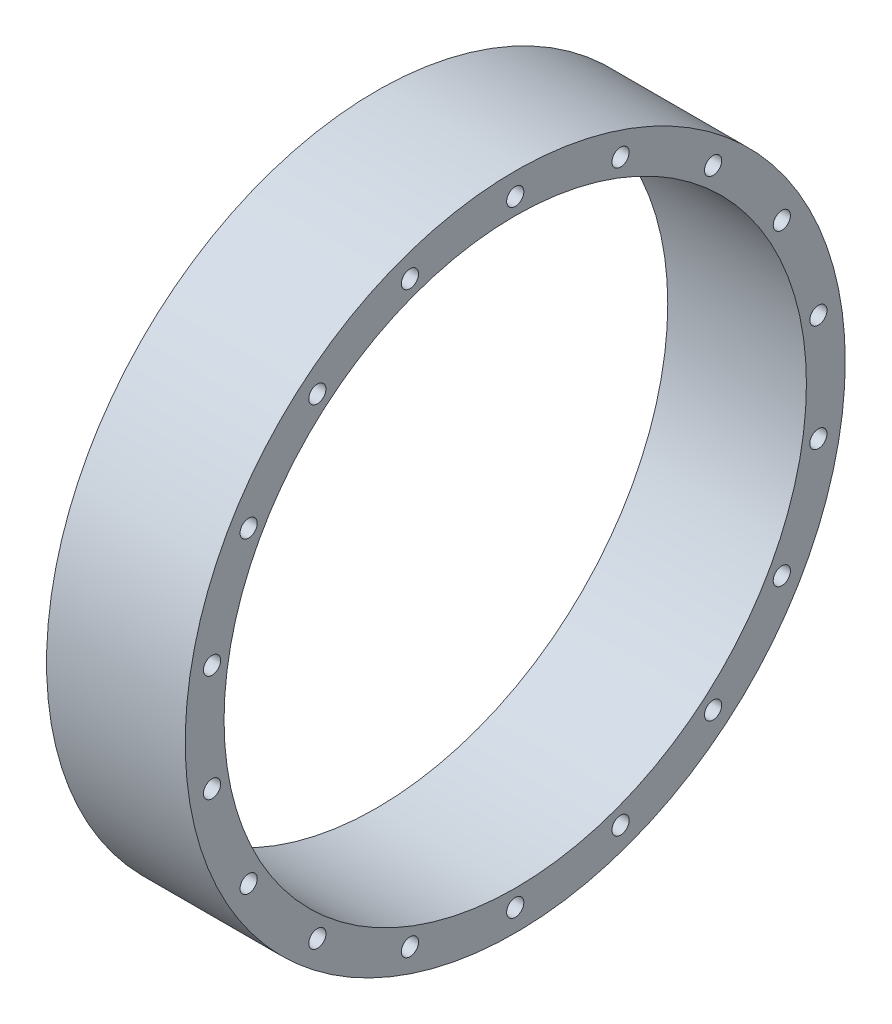
ISO-10303-21;
HEADER;
FILE_DESCRIPTION(('STEP AP214'),'2;1');
FILE_NAME('part.step','',(''),(''),'','','');
FILE_SCHEMA(('AUTOMOTIVE_DESIGN { 1 0 10303 214 1 1 1 1 }'));
ENDSEC;
DATA;
#1=APPLICATION_CONTEXT('core data for automotive mechanical design processes');
#2=APPLICATION_PROTOCOL_DEFINITION('international standard','automotive_design',2000,#1);
#3=PRODUCT_CONTEXT('',#1,'mechanical');
#4=PRODUCT('Part','Part','',(#3));
#5=PRODUCT_RELATED_PRODUCT_CATEGORY('part','',(#4));
#6=PRODUCT_DEFINITION_FORMATION('','',#4);
#7=PRODUCT_DEFINITION_CONTEXT('part definition',#1,'design');
#8=PRODUCT_DEFINITION('design','',#6,#7);
#9=PRODUCT_DEFINITION_SHAPE('','',#8);
#10=(LENGTH_UNIT() NAMED_UNIT(*) SI_UNIT(.MILLI.,.METRE.));
#11=(NAMED_UNIT(*) PLANE_ANGLE_UNIT() SI_UNIT($,.RADIAN.));
#12=(NAMED_UNIT(*) SI_UNIT($,.STERADIAN.) SOLID_ANGLE_UNIT());
#13=UNCERTAINTY_MEASURE_WITH_UNIT(LENGTH_MEASURE(1.E-05),#10,'distance_accuracy_value','');
#14=(GEOMETRIC_REPRESENTATION_CONTEXT(3) GLOBAL_UNCERTAINTY_ASSIGNED_CONTEXT((#13)) GLOBAL_UNIT_ASSIGNED_CONTEXT((#10,
#11,#12)) REPRESENTATION_CONTEXT('',''));
#15=CARTESIAN_POINT('',(0.,0.,0.));
#16=DIRECTION('',(0.,0.,1.));
#17=DIRECTION('',(1.,0.,0.));
#18=AXIS2_PLACEMENT_3D('',#15,#16,#17);
#19=CARTESIAN_POINT('',(25.,0.,0.));
#20=DIRECTION('',(1.,0.,0.));
#21=DIRECTION('',(0.,0.,-1.));
#22=AXIS2_PLACEMENT_3D('',#19,#20,#21);
#23=PLANE('',#22);
#24=CARTESIAN_POINT('',(25.,52.1529404536182,-18.982117954574));
#25=DIRECTION('',(1.,0.,0.));
#26=DIRECTION('',(0.,-0.342020143325657,-0.939692620785913));
#27=AXIS2_PLACEMENT_3D('',#24,#25,#26);
#28=CIRCLE('',#27,1.55);
#29=CARTESIAN_POINT('',(25.,51.6228092314634,-20.4386415167921));
#30=VERTEX_POINT('',#29);
#31=EDGE_CURVE('E72',#30,#30,#28,.T.);
#32=ORIENTED_EDGE('',*,*,#31,.F.);
#33=EDGE_LOOP('',(#32));
#34=FACE_BOUND('',#33,.T.);
#35=CARTESIAN_POINT('',(25.,42.5154665931037,-35.6747123376024));
#36=DIRECTION('',(1.,0.,0.));
#37=DIRECTION('',(0.,-0.64278760968653,-0.766044443118986));
#38=AXIS2_PLACEMENT_3D('',#35,#36,#37);
#39=CIRCLE('',#38,1.55);
#40=CARTESIAN_POINT('',(25.,41.5191457980896,-36.8620812244368));
#41=VERTEX_POINT('',#40);
#42=EDGE_CURVE('E78',#41,#41,#39,.T.);
#43=ORIENTED_EDGE('',*,*,#42,.F.);
#44=EDGE_LOOP('',(#43));
#45=FACE_BOUND('',#44,.T.);
#46=CARTESIAN_POINT('',(25.,27.7500000000006,-48.064409910036));
#47=DIRECTION('',(1.,0.,0.));
#48=DIRECTION('',(0.,-0.866025403784433,-0.50000000000001));
#49=AXIS2_PLACEMENT_3D('',#46,#47,#48);
#50=CIRCLE('',#49,1.55);
#51=CARTESIAN_POINT('',(25.,26.4076606241347,-48.839409910036));
#52=VERTEX_POINT('',#51);
#53=EDGE_CURVE('E84',#52,#52,#50,.T.);
#54=ORIENTED_EDGE('',*,*,#53,.F.);
#55=EDGE_LOOP('',(#54));
#56=FACE_BOUND('',#55,.T.);
#57=CARTESIAN_POINT('',(25.,9.6374738605152,-54.6568302921774));
#58=DIRECTION('',(1.,0.,0.));
#59=DIRECTION('',(0.,-0.984807753012206,-0.17364817766694));
#60=AXIS2_PLACEMENT_3D('',#57,#58,#59);
#61=CIRCLE('',#60,1.55);
#62=CARTESIAN_POINT('',(25.,8.11102184334628,-54.9259849675612));
#63=VERTEX_POINT('',#62);
#64=EDGE_CURVE('E90',#63,#63,#61,.T.);
#65=ORIENTED_EDGE('',*,*,#64,.F.);
#66=EDGE_LOOP('',(#65));
#67=FACE_BOUND('',#66,.T.);
#68=CARTESIAN_POINT('',(25.,-9.6374738605141,-54.6568302921776));
#69=DIRECTION('',(1.,0.,0.));
#70=DIRECTION('',(0.,-0.98480775301221,0.173648177666921));
#71=AXIS2_PLACEMENT_3D('',#68,#69,#70);
#72=CIRCLE('',#71,1.55);
#73=CARTESIAN_POINT('',(25.,-11.163925877683,-54.3876756167939));
#74=VERTEX_POINT('',#73);
#75=EDGE_CURVE('E96',#74,#74,#72,.T.);
#76=ORIENTED_EDGE('',*,*,#75,.F.);
#77=EDGE_LOOP('',(#76));
#78=FACE_BOUND('',#77,.T.);
#79=CARTESIAN_POINT('',(25.,-27.7499999999996,-48.0644099100366));
#80=DIRECTION('',(1.,0.,0.));
#81=DIRECTION('',(0.,-0.866025403784443,0.499999999999992));
#82=AXIS2_PLACEMENT_3D('',#79,#80,#81);
#83=CIRCLE('',#82,1.55);
#84=CARTESIAN_POINT('',(25.,-29.0923393758654,-47.2894099100366));
#85=VERTEX_POINT('',#84);
#86=EDGE_CURVE('E102',#85,#85,#83,.T.);
#87=ORIENTED_EDGE('',*,*,#86,.F.);
#88=EDGE_LOOP('',(#87));
#89=FACE_BOUND('',#88,.T.);
#90=CARTESIAN_POINT('',(25.,-42.515466593103,-35.6747123376033));
#91=DIRECTION('',(1.,0.,0.));
#92=DIRECTION('',(0.,-0.642787609686546,0.766044443118973));
#93=AXIS2_PLACEMENT_3D('',#90,#91,#92);
#94=CIRCLE('',#93,1.55);
#95=CARTESIAN_POINT('',(25.,-43.5117873881171,-34.4873434507689));
#96=VERTEX_POINT('',#95);
#97=EDGE_CURVE('E108',#96,#96,#94,.T.);
#98=ORIENTED_EDGE('',*,*,#97,.F.);
#99=EDGE_LOOP('',(#98));
#100=FACE_BOUND('',#99,.T.);
#101=CARTESIAN_POINT('',(25.,-52.1529404536178,-18.982117954575));
#102=DIRECTION('',(1.,0.,0.));
#103=DIRECTION('',(0.,-0.342020143325676,0.939692620785906));
#104=AXIS2_PLACEMENT_3D('',#101,#102,#103);
#105=CIRCLE('',#104,1.55);
#106=CARTESIAN_POINT('',(25.,-52.6830716757726,-17.5255943923569));
#107=VERTEX_POINT('',#106);
#108=EDGE_CURVE('E114',#107,#107,#105,.T.);
#109=ORIENTED_EDGE('',*,*,#108,.F.);
#110=EDGE_LOOP('',(#109));
#111=FACE_BOUND('',#110,.T.);
#112=CARTESIAN_POINT('',(25.,-55.5,0.));
#113=DIRECTION('',(1.,0.,0.));
#114=DIRECTION('',(0.,0.,1.));
#115=AXIS2_PLACEMENT_3D('',#112,#113,#114);
#116=CIRCLE('',#115,1.55);
#117=CARTESIAN_POINT('',(25.,-55.5,1.55));
#118=VERTEX_POINT('',#117);
#119=EDGE_CURVE('E120',#118,#118,#116,.T.);
#120=ORIENTED_EDGE('',*,*,#119,.F.);
#121=EDGE_LOOP('',(#120));
#122=FACE_BOUND('',#121,.T.);
#123=CARTESIAN_POINT('',(25.,-52.152940453618,18.9821179545743));
#124=DIRECTION('',(1.,0.,0.));
#125=DIRECTION('',(0.,0.342020143325663,0.939692620785911));
#126=AXIS2_PLACEMENT_3D('',#123,#124,#125);
#127=CIRCLE('',#126,1.55);
#128=CARTESIAN_POINT('',(25.,-51.6228092314633,20.4386415167925));
#129=VERTEX_POINT('',#128);
#130=EDGE_CURVE('E126',#129,#129,#127,.T.);
#131=ORIENTED_EDGE('',*,*,#130,.F.);
#132=EDGE_LOOP('',(#131));
#133=FACE_BOUND('',#132,.T.);
#134=CARTESIAN_POINT('',(25.,-42.5154665931035,35.6747123376027));
#135=DIRECTION('',(1.,0.,0.));
#136=DIRECTION('',(0.,0.642787609686535,0.766044443118981));
#137=AXIS2_PLACEMENT_3D('',#134,#135,#136);
#138=CIRCLE('',#137,1.55);
#139=CARTESIAN_POINT('',(25.,-41.5191457980893,36.8620812244371));
#140=VERTEX_POINT('',#139);
#141=EDGE_CURVE('E132',#140,#140,#138,.T.);
#142=ORIENTED_EDGE('',*,*,#141,.F.);
#143=EDGE_LOOP('',(#142));
#144=FACE_BOUND('',#143,.T.);
#145=CARTESIAN_POINT('',(25.,-27.7500000000002,48.0644099100362));
#146=DIRECTION('',(1.,0.,0.));
#147=DIRECTION('',(0.,0.866025403784436,0.500000000000004));
#148=AXIS2_PLACEMENT_3D('',#145,#146,#147);
#149=CIRCLE('',#148,1.55);
#150=CARTESIAN_POINT('',(25.,-26.4076606241344,48.8394099100362));
#151=VERTEX_POINT('',#150);
#152=EDGE_CURVE('E138',#151,#151,#149,.T.);
#153=ORIENTED_EDGE('',*,*,#152,.F.);
#154=EDGE_LOOP('',(#153));
#155=FACE_BOUND('',#154,.T.);
#156=CARTESIAN_POINT('',(25.,-9.63747386051484,54.6568302921775));
#157=DIRECTION('',(1.,0.,0.));
#158=DIRECTION('',(0.,0.984807753012207,0.173648177666934));
#159=AXIS2_PLACEMENT_3D('',#156,#157,#158);
#160=CIRCLE('',#159,1.55);
#161=CARTESIAN_POINT('',(25.,-8.11102184334592,54.9259849675613));
#162=VERTEX_POINT('',#161);
#163=EDGE_CURVE('E144',#162,#162,#160,.T.);
#164=ORIENTED_EDGE('',*,*,#163,.F.);
#165=EDGE_LOOP('',(#164));
#166=FACE_BOUND('',#165,.T.);
#167=CARTESIAN_POINT('',(25.,9.63747386051447,54.6568302921776));
#168=DIRECTION('',(1.,0.,0.));
#169=DIRECTION('',(0.,0.984807753012209,-0.173648177666927));
#170=AXIS2_PLACEMENT_3D('',#167,#168,#169);
#171=CIRCLE('',#170,1.55);
#172=CARTESIAN_POINT('',(25.,11.1639258776834,54.3876756167938));
#173=VERTEX_POINT('',#172);
#174=EDGE_CURVE('E150',#173,#173,#171,.T.);
#175=ORIENTED_EDGE('',*,*,#174,.F.);
#176=EDGE_LOOP('',(#175));
#177=FACE_BOUND('',#176,.T.);
#178=CARTESIAN_POINT('',(25.,27.7499999999999,48.0644099100364));
#179=DIRECTION('',(1.,0.,0.));
#180=DIRECTION('',(0.,0.86602540378444,-0.499999999999998));
#181=AXIS2_PLACEMENT_3D('',#178,#179,#180);
#182=CIRCLE('',#181,1.55);
#183=CARTESIAN_POINT('',(25.,29.0923393758658,47.2894099100364));
#184=VERTEX_POINT('',#183);
#185=EDGE_CURVE('E156',#184,#184,#182,.T.);
#186=ORIENTED_EDGE('',*,*,#185,.F.);
#187=EDGE_LOOP('',(#186));
#188=FACE_BOUND('',#187,.T.);
#189=CARTESIAN_POINT('',(25.,42.5154665931032,35.674712337603));
#190=DIRECTION('',(1.,0.,0.));
#191=DIRECTION('',(0.,0.642787609686541,-0.766044443118977));
#192=AXIS2_PLACEMENT_3D('',#189,#190,#191);
#193=CIRCLE('',#192,1.55);
#194=CARTESIAN_POINT('',(25.,43.5117873881174,34.4873434507686));
#195=VERTEX_POINT('',#194);
#196=EDGE_CURVE('E162',#195,#195,#193,.T.);
#197=ORIENTED_EDGE('',*,*,#196,.F.);
#198=EDGE_LOOP('',(#197));
#199=FACE_BOUND('',#198,.T.);
#200=CARTESIAN_POINT('',(25.,52.1529404536179,18.9821179545747));
#201=DIRECTION('',(1.,0.,0.));
#202=DIRECTION('',(0.,0.342020143325669,-0.939692620785908));
#203=AXIS2_PLACEMENT_3D('',#200,#201,#202);
#204=CIRCLE('',#203,1.55);
#205=CARTESIAN_POINT('',(25.,52.6830716757727,17.5255943923565));
#206=VERTEX_POINT('',#205);
#207=EDGE_CURVE('E66',#206,#206,#204,.T.);
#208=ORIENTED_EDGE('',*,*,#207,.F.);
#209=EDGE_LOOP('',(#208));
#210=FACE_BOUND('',#209,.T.);
#211=CARTESIAN_POINT('',(25.,55.5,0.));
#212=DIRECTION('',(1.,0.,0.));
#213=DIRECTION('',(0.,0.,-1.));
#214=AXIS2_PLACEMENT_3D('',#211,#212,#213);
#215=CIRCLE('',#214,1.55);
#216=CARTESIAN_POINT('',(25.,55.5,-1.55));
#217=VERTEX_POINT('',#216);
#218=EDGE_CURVE('E60',#217,#217,#215,.T.);
#219=ORIENTED_EDGE('',*,*,#218,.F.);
#220=EDGE_LOOP('',(#219));
#221=FACE_BOUND('',#220,.T.);
#222=CARTESIAN_POINT('',(25.,0.,0.));
#223=DIRECTION('',(1.,0.,0.));
#224=DIRECTION('',(0.,0.,-1.));
#225=AXIS2_PLACEMENT_3D('',#222,#223,#224);
#226=CIRCLE('',#225,59.5);
#227=CARTESIAN_POINT('',(25.,0.,-59.5));
#228=VERTEX_POINT('',#227);
#229=EDGE_CURVE('E10',#228,#228,#226,.T.);
#230=ORIENTED_EDGE('',*,*,#229,.T.);
#231=EDGE_LOOP('',(#230));
#232=FACE_BOUND('',#231,.T.);
#233=CARTESIAN_POINT('',(25.,0.,0.));
#234=DIRECTION('',(1.,0.,0.));
#235=DIRECTION('',(0.,0.,-1.));
#236=AXIS2_PLACEMENT_3D('',#233,#234,#235);
#237=CIRCLE('',#236,52.5);
#238=CARTESIAN_POINT('',(25.,0.,-52.5));
#239=VERTEX_POINT('',#238);
#240=EDGE_CURVE('E52',#239,#239,#237,.T.);
#241=ORIENTED_EDGE('',*,*,#240,.F.);
#242=EDGE_LOOP('',(#241));
#243=FACE_BOUND('',#242,.T.);
#244=ADVANCED_FACE('F41',(#34,#45,#56,#67,#78,#89,#100,#111,#122,#133,#144,#155,#166,#177,#188,
#199,#210,#221,#232,#243),#23,.T.);
#245=CARTESIAN_POINT('',(0.,0.,0.));
#246=DIRECTION('',(1.,0.,0.));
#247=DIRECTION('',(0.,0.,-1.));
#248=AXIS2_PLACEMENT_3D('',#245,#246,#247);
#249=PLANE('',#248);
#250=CARTESIAN_POINT('',(0.,52.1529404536182,-18.982117954574));
#251=DIRECTION('',(1.,0.,0.));
#252=DIRECTION('',(0.,-0.342020143325657,-0.939692620785913));
#253=AXIS2_PLACEMENT_3D('',#250,#251,#252);
#254=CIRCLE('',#253,1.55);
#255=CARTESIAN_POINT('',(0.,51.6228092314634,-20.4386415167921));
#256=VERTEX_POINT('',#255);
#257=EDGE_CURVE('E75',#256,#256,#254,.T.);
#258=ORIENTED_EDGE('',*,*,#257,.T.);
#259=EDGE_LOOP('',(#258));
#260=FACE_BOUND('',#259,.T.);
#261=CARTESIAN_POINT('',(0.,42.5154665931037,-35.6747123376024));
#262=DIRECTION('',(1.,0.,0.));
#263=DIRECTION('',(0.,-0.64278760968653,-0.766044443118986));
#264=AXIS2_PLACEMENT_3D('',#261,#262,#263);
#265=CIRCLE('',#264,1.55);
#266=CARTESIAN_POINT('',(0.,41.5191457980896,-36.8620812244368));
#267=VERTEX_POINT('',#266);
#268=EDGE_CURVE('E81',#267,#267,#265,.T.);
#269=ORIENTED_EDGE('',*,*,#268,.T.);
#270=EDGE_LOOP('',(#269));
#271=FACE_BOUND('',#270,.T.);
#272=CARTESIAN_POINT('',(0.,27.7500000000006,-48.064409910036));
#273=DIRECTION('',(1.,0.,0.));
#274=DIRECTION('',(0.,-0.866025403784433,-0.50000000000001));
#275=AXIS2_PLACEMENT_3D('',#272,#273,#274);
#276=CIRCLE('',#275,1.55);
#277=CARTESIAN_POINT('',(0.,26.4076606241347,-48.839409910036));
#278=VERTEX_POINT('',#277);
#279=EDGE_CURVE('E87',#278,#278,#276,.T.);
#280=ORIENTED_EDGE('',*,*,#279,.T.);
#281=EDGE_LOOP('',(#280));
#282=FACE_BOUND('',#281,.T.);
#283=CARTESIAN_POINT('',(0.,9.6374738605152,-54.6568302921774));
#284=DIRECTION('',(1.,0.,0.));
#285=DIRECTION('',(0.,-0.984807753012206,-0.17364817766694));
#286=AXIS2_PLACEMENT_3D('',#283,#284,#285);
#287=CIRCLE('',#286,1.55);
#288=CARTESIAN_POINT('',(0.,8.11102184334628,-54.9259849675612));
#289=VERTEX_POINT('',#288);
#290=EDGE_CURVE('E93',#289,#289,#287,.T.);
#291=ORIENTED_EDGE('',*,*,#290,.T.);
#292=EDGE_LOOP('',(#291));
#293=FACE_BOUND('',#292,.T.);
#294=CARTESIAN_POINT('',(0.,-9.6374738605141,-54.6568302921776));
#295=DIRECTION('',(1.,0.,0.));
#296=DIRECTION('',(0.,-0.98480775301221,0.173648177666921));
#297=AXIS2_PLACEMENT_3D('',#294,#295,#296);
#298=CIRCLE('',#297,1.55);
#299=CARTESIAN_POINT('',(0.,-11.163925877683,-54.3876756167939));
#300=VERTEX_POINT('',#299);
#301=EDGE_CURVE('E99',#300,#300,#298,.T.);
#302=ORIENTED_EDGE('',*,*,#301,.T.);
#303=EDGE_LOOP('',(#302));
#304=FACE_BOUND('',#303,.T.);
#305=CARTESIAN_POINT('',(0.,-27.7499999999996,-48.0644099100366));
#306=DIRECTION('',(1.,0.,0.));
#307=DIRECTION('',(0.,-0.866025403784443,0.499999999999992));
#308=AXIS2_PLACEMENT_3D('',#305,#306,#307);
#309=CIRCLE('',#308,1.55);
#310=CARTESIAN_POINT('',(0.,-29.0923393758654,-47.2894099100366));
#311=VERTEX_POINT('',#310);
#312=EDGE_CURVE('E105',#311,#311,#309,.T.);
#313=ORIENTED_EDGE('',*,*,#312,.T.);
#314=EDGE_LOOP('',(#313));
#315=FACE_BOUND('',#314,.T.);
#316=CARTESIAN_POINT('',(0.,-42.515466593103,-35.6747123376033));
#317=DIRECTION('',(1.,0.,0.));
#318=DIRECTION('',(0.,-0.642787609686546,0.766044443118973));
#319=AXIS2_PLACEMENT_3D('',#316,#317,#318);
#320=CIRCLE('',#319,1.55);
#321=CARTESIAN_POINT('',(0.,-43.5117873881171,-34.4873434507689));
#322=VERTEX_POINT('',#321);
#323=EDGE_CURVE('E111',#322,#322,#320,.T.);
#324=ORIENTED_EDGE('',*,*,#323,.T.);
#325=EDGE_LOOP('',(#324));
#326=FACE_BOUND('',#325,.T.);
#327=CARTESIAN_POINT('',(0.,-52.1529404536178,-18.982117954575));
#328=DIRECTION('',(1.,0.,0.));
#329=DIRECTION('',(0.,-0.342020143325676,0.939692620785906));
#330=AXIS2_PLACEMENT_3D('',#327,#328,#329);
#331=CIRCLE('',#330,1.55);
#332=CARTESIAN_POINT('',(0.,-52.6830716757726,-17.5255943923569));
#333=VERTEX_POINT('',#332);
#334=EDGE_CURVE('E117',#333,#333,#331,.T.);
#335=ORIENTED_EDGE('',*,*,#334,.T.);
#336=EDGE_LOOP('',(#335));
#337=FACE_BOUND('',#336,.T.);
#338=CARTESIAN_POINT('',(0.,-55.5,0.));
#339=DIRECTION('',(1.,0.,0.));
#340=DIRECTION('',(0.,0.,1.));
#341=AXIS2_PLACEMENT_3D('',#338,#339,#340);
#342=CIRCLE('',#341,1.55);
#343=CARTESIAN_POINT('',(0.,-55.5,1.55));
#344=VERTEX_POINT('',#343);
#345=EDGE_CURVE('E123',#344,#344,#342,.T.);
#346=ORIENTED_EDGE('',*,*,#345,.T.);
#347=EDGE_LOOP('',(#346));
#348=FACE_BOUND('',#347,.T.);
#349=CARTESIAN_POINT('',(0.,-52.152940453618,18.9821179545743));
#350=DIRECTION('',(1.,0.,0.));
#351=DIRECTION('',(0.,0.342020143325663,0.939692620785911));
#352=AXIS2_PLACEMENT_3D('',#349,#350,#351);
#353=CIRCLE('',#352,1.55);
#354=CARTESIAN_POINT('',(0.,-51.6228092314633,20.4386415167925));
#355=VERTEX_POINT('',#354);
#356=EDGE_CURVE('E129',#355,#355,#353,.T.);
#357=ORIENTED_EDGE('',*,*,#356,.T.);
#358=EDGE_LOOP('',(#357));
#359=FACE_BOUND('',#358,.T.);
#360=CARTESIAN_POINT('',(0.,-42.5154665931035,35.6747123376027));
#361=DIRECTION('',(1.,0.,0.));
#362=DIRECTION('',(0.,0.642787609686535,0.766044443118981));
#363=AXIS2_PLACEMENT_3D('',#360,#361,#362);
#364=CIRCLE('',#363,1.55);
#365=CARTESIAN_POINT('',(0.,-41.5191457980893,36.8620812244371));
#366=VERTEX_POINT('',#365);
#367=EDGE_CURVE('E135',#366,#366,#364,.T.);
#368=ORIENTED_EDGE('',*,*,#367,.T.);
#369=EDGE_LOOP('',(#368));
#370=FACE_BOUND('',#369,.T.);
#371=CARTESIAN_POINT('',(0.,-27.7500000000002,48.0644099100362));
#372=DIRECTION('',(1.,0.,0.));
#373=DIRECTION('',(0.,0.866025403784436,0.500000000000004));
#374=AXIS2_PLACEMENT_3D('',#371,#372,#373);
#375=CIRCLE('',#374,1.55);
#376=CARTESIAN_POINT('',(0.,-26.4076606241344,48.8394099100362));
#377=VERTEX_POINT('',#376);
#378=EDGE_CURVE('E141',#377,#377,#375,.T.);
#379=ORIENTED_EDGE('',*,*,#378,.T.);
#380=EDGE_LOOP('',(#379));
#381=FACE_BOUND('',#380,.T.);
#382=CARTESIAN_POINT('',(0.,-9.63747386051484,54.6568302921775));
#383=DIRECTION('',(1.,0.,0.));
#384=DIRECTION('',(0.,0.984807753012207,0.173648177666934));
#385=AXIS2_PLACEMENT_3D('',#382,#383,#384);
#386=CIRCLE('',#385,1.55);
#387=CARTESIAN_POINT('',(0.,-8.11102184334592,54.9259849675613));
#388=VERTEX_POINT('',#387);
#389=EDGE_CURVE('E147',#388,#388,#386,.T.);
#390=ORIENTED_EDGE('',*,*,#389,.T.);
#391=EDGE_LOOP('',(#390));
#392=FACE_BOUND('',#391,.T.);
#393=CARTESIAN_POINT('',(0.,9.63747386051447,54.6568302921776));
#394=DIRECTION('',(1.,0.,0.));
#395=DIRECTION('',(0.,0.984807753012209,-0.173648177666927));
#396=AXIS2_PLACEMENT_3D('',#393,#394,#395);
#397=CIRCLE('',#396,1.55);
#398=CARTESIAN_POINT('',(0.,11.1639258776834,54.3876756167938));
#399=VERTEX_POINT('',#398);
#400=EDGE_CURVE('E153',#399,#399,#397,.T.);
#401=ORIENTED_EDGE('',*,*,#400,.T.);
#402=EDGE_LOOP('',(#401));
#403=FACE_BOUND('',#402,.T.);
#404=CARTESIAN_POINT('',(0.,27.7499999999999,48.0644099100364));
#405=DIRECTION('',(1.,0.,0.));
#406=DIRECTION('',(0.,0.86602540378444,-0.499999999999998));
#407=AXIS2_PLACEMENT_3D('',#404,#405,#406);
#408=CIRCLE('',#407,1.55);
#409=CARTESIAN_POINT('',(0.,29.0923393758658,47.2894099100364));
#410=VERTEX_POINT('',#409);
#411=EDGE_CURVE('E159',#410,#410,#408,.T.);
#412=ORIENTED_EDGE('',*,*,#411,.T.);
#413=EDGE_LOOP('',(#412));
#414=FACE_BOUND('',#413,.T.);
#415=CARTESIAN_POINT('',(0.,42.5154665931032,35.674712337603));
#416=DIRECTION('',(1.,0.,0.));
#417=DIRECTION('',(0.,0.642787609686541,-0.766044443118977));
#418=AXIS2_PLACEMENT_3D('',#415,#416,#417);
#419=CIRCLE('',#418,1.55);
#420=CARTESIAN_POINT('',(0.,43.5117873881174,34.4873434507686));
#421=VERTEX_POINT('',#420);
#422=EDGE_CURVE('E69',#421,#421,#419,.T.);
#423=ORIENTED_EDGE('',*,*,#422,.T.);
#424=EDGE_LOOP('',(#423));
#425=FACE_BOUND('',#424,.T.);
#426=CARTESIAN_POINT('',(0.,52.1529404536179,18.9821179545747));
#427=DIRECTION('',(1.,0.,0.));
#428=DIRECTION('',(0.,0.342020143325669,-0.939692620785908));
#429=AXIS2_PLACEMENT_3D('',#426,#427,#428);
#430=CIRCLE('',#429,1.55);
#431=CARTESIAN_POINT('',(0.,52.6830716757727,17.5255943923565));
#432=VERTEX_POINT('',#431);
#433=EDGE_CURVE('E63',#432,#432,#430,.T.);
#434=ORIENTED_EDGE('',*,*,#433,.T.);
#435=EDGE_LOOP('',(#434));
#436=FACE_BOUND('',#435,.T.);
#437=CARTESIAN_POINT('',(0.,55.5,0.));
#438=DIRECTION('',(1.,0.,0.));
#439=DIRECTION('',(0.,0.,-1.));
#440=AXIS2_PLACEMENT_3D('',#437,#438,#439);
#441=CIRCLE('',#440,1.55);
#442=CARTESIAN_POINT('',(0.,55.5,-1.55));
#443=VERTEX_POINT('',#442);
#444=EDGE_CURVE('E57',#443,#443,#441,.T.);
#445=ORIENTED_EDGE('',*,*,#444,.T.);
#446=EDGE_LOOP('',(#445));
#447=FACE_BOUND('',#446,.T.);
#448=CARTESIAN_POINT('',(0.,0.,0.));
#449=DIRECTION('',(1.,0.,0.));
#450=DIRECTION('',(0.,0.,-1.));
#451=AXIS2_PLACEMENT_3D('',#448,#449,#450);
#452=CIRCLE('',#451,59.5);
#453=CARTESIAN_POINT('',(0.,0.,-59.5));
#454=VERTEX_POINT('',#453);
#455=EDGE_CURVE('E45',#454,#454,#452,.T.);
#456=ORIENTED_EDGE('',*,*,#455,.F.);
#457=EDGE_LOOP('',(#456));
#458=FACE_BOUND('',#457,.T.);
#459=CARTESIAN_POINT('',(0.,0.,0.));
#460=DIRECTION('',(1.,0.,0.));
#461=DIRECTION('',(0.,0.,-1.));
#462=AXIS2_PLACEMENT_3D('',#459,#460,#461);
#463=CIRCLE('',#462,52.5);
#464=CARTESIAN_POINT('',(0.,0.,-52.5));
#465=VERTEX_POINT('',#464);
#466=EDGE_CURVE('E54',#465,#465,#463,.T.);
#467=ORIENTED_EDGE('',*,*,#466,.T.);
#468=EDGE_LOOP('',(#467));
#469=FACE_BOUND('',#468,.T.);
#470=ADVANCED_FACE('F168',(#260,#271,#282,#293,#304,#315,#326,#337,#348,#359,#370,#381,#392,
#403,#414,#425,#436,#447,#458,#469),#249,.F.);
#471=CARTESIAN_POINT('',(25.,0.,0.));
#472=DIRECTION('',(-1.,0.,0.));
#473=DIRECTION('',(0.,0.,1.));
#474=AXIS2_PLACEMENT_3D('',#471,#472,#473);
#475=CYLINDRICAL_SURFACE('',#474,59.5);
#476=ORIENTED_EDGE('',*,*,#229,.F.);
#477=EDGE_LOOP('',(#476));
#478=FACE_BOUND('',#477,.T.);
#479=ORIENTED_EDGE('',*,*,#455,.T.);
#480=EDGE_LOOP('',(#479));
#481=FACE_BOUND('',#480,.T.);
#482=ADVANCED_FACE('F43',(#478,#481),#475,.T.);
#483=CARTESIAN_POINT('',(25.,0.,0.));
#484=DIRECTION('',(-1.,0.,0.));
#485=DIRECTION('',(0.,0.,1.));
#486=AXIS2_PLACEMENT_3D('',#483,#484,#485);
#487=CYLINDRICAL_SURFACE('',#486,52.5);
#488=ORIENTED_EDGE('',*,*,#240,.T.);
#489=EDGE_LOOP('',(#488));
#490=FACE_BOUND('',#489,.T.);
#491=ORIENTED_EDGE('',*,*,#466,.F.);
#492=EDGE_LOOP('',(#491));
#493=FACE_BOUND('',#492,.T.);
#494=ADVANCED_FACE('F189',(#490,#493),#487,.F.);
#495=CARTESIAN_POINT('',(0.,55.5,0.));
#496=DIRECTION('',(1.,0.,0.));
#497=DIRECTION('',(0.,0.,-1.));
#498=AXIS2_PLACEMENT_3D('',#495,#496,#497);
#499=CYLINDRICAL_SURFACE('',#498,1.55);
#500=ORIENTED_EDGE('',*,*,#444,.F.);
#501=EDGE_LOOP('',(#500));
#502=FACE_BOUND('',#501,.T.);
#503=ORIENTED_EDGE('',*,*,#218,.T.);
#504=EDGE_LOOP('',(#503));
#505=FACE_BOUND('',#504,.T.);
#506=ADVANCED_FACE('F192',(#502,#505),#499,.F.);
#507=CARTESIAN_POINT('',(0.,52.1529404536179,18.9821179545747));
#508=DIRECTION('',(1.,0.,0.));
#509=DIRECTION('',(0.,0.,-1.));
#510=AXIS2_PLACEMENT_3D('',#507,#508,#509);
#511=CYLINDRICAL_SURFACE('',#510,1.55);
#512=ORIENTED_EDGE('',*,*,#433,.F.);
#513=EDGE_LOOP('',(#512));
#514=FACE_BOUND('',#513,.T.);
#515=ORIENTED_EDGE('',*,*,#207,.T.);
#516=EDGE_LOOP('',(#515));
#517=FACE_BOUND('',#516,.T.);
#518=ADVANCED_FACE('F175',(#514,#517),#511,.F.);
#519=CARTESIAN_POINT('',(0.,42.5154665931032,35.674712337603));
#520=DIRECTION('',(1.,0.,0.));
#521=DIRECTION('',(0.,0.,-1.));
#522=AXIS2_PLACEMENT_3D('',#519,#520,#521);
#523=CYLINDRICAL_SURFACE('',#522,1.55);
#524=ORIENTED_EDGE('',*,*,#422,.F.);
#525=EDGE_LOOP('',(#524));
#526=FACE_BOUND('',#525,.T.);
#527=ORIENTED_EDGE('',*,*,#196,.T.);
#528=EDGE_LOOP('',(#527));
#529=FACE_BOUND('',#528,.T.);
#530=ADVANCED_FACE('F171',(#526,#529),#523,.F.);
#531=CARTESIAN_POINT('',(0.,27.7499999999999,48.0644099100364));
#532=DIRECTION('',(1.,0.,0.));
#533=DIRECTION('',(0.,0.,-1.));
#534=AXIS2_PLACEMENT_3D('',#531,#532,#533);
#535=CYLINDRICAL_SURFACE('',#534,1.55);
#536=ORIENTED_EDGE('',*,*,#411,.F.);
#537=EDGE_LOOP('',(#536));
#538=FACE_BOUND('',#537,.T.);
#539=ORIENTED_EDGE('',*,*,#185,.T.);
#540=EDGE_LOOP('',(#539));
#541=FACE_BOUND('',#540,.T.);
#542=ADVANCED_FACE('F174',(#538,#541),#535,.F.);
#543=CARTESIAN_POINT('',(0.,9.63747386051447,54.6568302921776));
#544=DIRECTION('',(1.,0.,0.));
#545=DIRECTION('',(0.,0.,-1.));
#546=AXIS2_PLACEMENT_3D('',#543,#544,#545);
#547=CYLINDRICAL_SURFACE('',#546,1.55);
#548=ORIENTED_EDGE('',*,*,#400,.F.);
#549=EDGE_LOOP('',(#548));
#550=FACE_BOUND('',#549,.T.);
#551=ORIENTED_EDGE('',*,*,#174,.T.);
#552=EDGE_LOOP('',(#551));
#553=FACE_BOUND('',#552,.T.);
#554=ADVANCED_FACE('F261',(#550,#553),#547,.F.);
#555=CARTESIAN_POINT('',(0.,-9.63747386051484,54.6568302921775));
#556=DIRECTION('',(1.,0.,0.));
#557=DIRECTION('',(0.,0.,-1.));
#558=AXIS2_PLACEMENT_3D('',#555,#556,#557);
#559=CYLINDRICAL_SURFACE('',#558,1.55);
#560=ORIENTED_EDGE('',*,*,#389,.F.);
#561=EDGE_LOOP('',(#560));
#562=FACE_BOUND('',#561,.T.);
#563=ORIENTED_EDGE('',*,*,#163,.T.);
#564=EDGE_LOOP('',(#563));
#565=FACE_BOUND('',#564,.T.);
#566=ADVANCED_FACE('F257',(#562,#565),#559,.F.);
#567=CARTESIAN_POINT('',(0.,-27.7500000000002,48.0644099100362));
#568=DIRECTION('',(1.,0.,0.));
#569=DIRECTION('',(0.,0.,-1.));
#570=AXIS2_PLACEMENT_3D('',#567,#568,#569);
#571=CYLINDRICAL_SURFACE('',#570,1.55);
#572=ORIENTED_EDGE('',*,*,#378,.F.);
#573=EDGE_LOOP('',(#572));
#574=FACE_BOUND('',#573,.T.);
#575=ORIENTED_EDGE('',*,*,#152,.T.);
#576=EDGE_LOOP('',(#575));
#577=FACE_BOUND('',#576,.T.);
#578=ADVANCED_FACE('F253',(#574,#577),#571,.F.);
#579=CARTESIAN_POINT('',(0.,-42.5154665931035,35.6747123376027));
#580=DIRECTION('',(1.,0.,0.));
#581=DIRECTION('',(0.,0.,-1.));
#582=AXIS2_PLACEMENT_3D('',#579,#580,#581);
#583=CYLINDRICAL_SURFACE('',#582,1.55);
#584=ORIENTED_EDGE('',*,*,#367,.F.);
#585=EDGE_LOOP('',(#584));
#586=FACE_BOUND('',#585,.T.);
#587=ORIENTED_EDGE('',*,*,#141,.T.);
#588=EDGE_LOOP('',(#587));
#589=FACE_BOUND('',#588,.T.);
#590=ADVANCED_FACE('F249',(#586,#589),#583,.F.);
#591=CARTESIAN_POINT('',(0.,-52.152940453618,18.9821179545743));
#592=DIRECTION('',(1.,0.,0.));
#593=DIRECTION('',(0.,0.,-1.));
#594=AXIS2_PLACEMENT_3D('',#591,#592,#593);
#595=CYLINDRICAL_SURFACE('',#594,1.55);
#596=ORIENTED_EDGE('',*,*,#356,.F.);
#597=EDGE_LOOP('',(#596));
#598=FACE_BOUND('',#597,.T.);
#599=ORIENTED_EDGE('',*,*,#130,.T.);
#600=EDGE_LOOP('',(#599));
#601=FACE_BOUND('',#600,.T.);
#602=ADVANCED_FACE('F245',(#598,#601),#595,.F.);
#603=CARTESIAN_POINT('',(0.,-55.5,0.));
#604=DIRECTION('',(1.,0.,0.));
#605=DIRECTION('',(0.,0.,-1.));
#606=AXIS2_PLACEMENT_3D('',#603,#604,#605);
#607=CYLINDRICAL_SURFACE('',#606,1.55);
#608=ORIENTED_EDGE('',*,*,#345,.F.);
#609=EDGE_LOOP('',(#608));
#610=FACE_BOUND('',#609,.T.);
#611=ORIENTED_EDGE('',*,*,#119,.T.);
#612=EDGE_LOOP('',(#611));
#613=FACE_BOUND('',#612,.T.);
#614=ADVANCED_FACE('F241',(#610,#613),#607,.F.);
#615=CARTESIAN_POINT('',(0.,-52.1529404536178,-18.982117954575));
#616=DIRECTION('',(1.,0.,0.));
#617=DIRECTION('',(0.,0.,-1.));
#618=AXIS2_PLACEMENT_3D('',#615,#616,#617);
#619=CYLINDRICAL_SURFACE('',#618,1.55);
#620=ORIENTED_EDGE('',*,*,#334,.F.);
#621=EDGE_LOOP('',(#620));
#622=FACE_BOUND('',#621,.T.);
#623=ORIENTED_EDGE('',*,*,#108,.T.);
#624=EDGE_LOOP('',(#623));
#625=FACE_BOUND('',#624,.T.);
#626=ADVANCED_FACE('F237',(#622,#625),#619,.F.);
#627=CARTESIAN_POINT('',(0.,-42.515466593103,-35.6747123376033));
#628=DIRECTION('',(1.,0.,0.));
#629=DIRECTION('',(0.,0.,-1.));
#630=AXIS2_PLACEMENT_3D('',#627,#628,#629);
#631=CYLINDRICAL_SURFACE('',#630,1.55);
#632=ORIENTED_EDGE('',*,*,#323,.F.);
#633=EDGE_LOOP('',(#632));
#634=FACE_BOUND('',#633,.T.);
#635=ORIENTED_EDGE('',*,*,#97,.T.);
#636=EDGE_LOOP('',(#635));
#637=FACE_BOUND('',#636,.T.);
#638=ADVANCED_FACE('F233',(#634,#637),#631,.F.);
#639=CARTESIAN_POINT('',(0.,-27.7499999999996,-48.0644099100366));
#640=DIRECTION('',(1.,0.,0.));
#641=DIRECTION('',(0.,0.,-1.));
#642=AXIS2_PLACEMENT_3D('',#639,#640,#641);
#643=CYLINDRICAL_SURFACE('',#642,1.55);
#644=ORIENTED_EDGE('',*,*,#312,.F.);
#645=EDGE_LOOP('',(#644));
#646=FACE_BOUND('',#645,.T.);
#647=ORIENTED_EDGE('',*,*,#86,.T.);
#648=EDGE_LOOP('',(#647));
#649=FACE_BOUND('',#648,.T.);
#650=ADVANCED_FACE('F229',(#646,#649),#643,.F.);
#651=CARTESIAN_POINT('',(0.,-9.6374738605141,-54.6568302921776));
#652=DIRECTION('',(1.,0.,0.));
#653=DIRECTION('',(0.,0.,-1.));
#654=AXIS2_PLACEMENT_3D('',#651,#652,#653);
#655=CYLINDRICAL_SURFACE('',#654,1.55);
#656=ORIENTED_EDGE('',*,*,#301,.F.);
#657=EDGE_LOOP('',(#656));
#658=FACE_BOUND('',#657,.T.);
#659=ORIENTED_EDGE('',*,*,#75,.T.);
#660=EDGE_LOOP('',(#659));
#661=FACE_BOUND('',#660,.T.);
#662=ADVANCED_FACE('F225',(#658,#661),#655,.F.);
#663=CARTESIAN_POINT('',(0.,9.6374738605152,-54.6568302921774));
#664=DIRECTION('',(1.,0.,0.));
#665=DIRECTION('',(0.,0.,-1.));
#666=AXIS2_PLACEMENT_3D('',#663,#664,#665);
#667=CYLINDRICAL_SURFACE('',#666,1.55);
#668=ORIENTED_EDGE('',*,*,#290,.F.);
#669=EDGE_LOOP('',(#668));
#670=FACE_BOUND('',#669,.T.);
#671=ORIENTED_EDGE('',*,*,#64,.T.);
#672=EDGE_LOOP('',(#671));
#673=FACE_BOUND('',#672,.T.);
#674=ADVANCED_FACE('F221',(#670,#673),#667,.F.);
#675=CARTESIAN_POINT('',(0.,27.7500000000006,-48.064409910036));
#676=DIRECTION('',(1.,0.,0.));
#677=DIRECTION('',(0.,0.,-1.));
#678=AXIS2_PLACEMENT_3D('',#675,#676,#677);
#679=CYLINDRICAL_SURFACE('',#678,1.55);
#680=ORIENTED_EDGE('',*,*,#279,.F.);
#681=EDGE_LOOP('',(#680));
#682=FACE_BOUND('',#681,.T.);
#683=ORIENTED_EDGE('',*,*,#53,.T.);
#684=EDGE_LOOP('',(#683));
#685=FACE_BOUND('',#684,.T.);
#686=ADVANCED_FACE('F217',(#682,#685),#679,.F.);
#687=CARTESIAN_POINT('',(0.,42.5154665931037,-35.6747123376024));
#688=DIRECTION('',(1.,0.,0.));
#689=DIRECTION('',(0.,0.,-1.));
#690=AXIS2_PLACEMENT_3D('',#687,#688,#689);
#691=CYLINDRICAL_SURFACE('',#690,1.55);
#692=ORIENTED_EDGE('',*,*,#268,.F.);
#693=EDGE_LOOP('',(#692));
#694=FACE_BOUND('',#693,.T.);
#695=ORIENTED_EDGE('',*,*,#42,.T.);
#696=EDGE_LOOP('',(#695));
#697=FACE_BOUND('',#696,.T.);
#698=ADVANCED_FACE('F213',(#694,#697),#691,.F.);
#699=CARTESIAN_POINT('',(0.,52.1529404536182,-18.982117954574));
#700=DIRECTION('',(1.,0.,0.));
#701=DIRECTION('',(0.,0.,-1.));
#702=AXIS2_PLACEMENT_3D('',#699,#700,#701);
#703=CYLINDRICAL_SURFACE('',#702,1.55);
#704=ORIENTED_EDGE('',*,*,#257,.F.);
#705=EDGE_LOOP('',(#704));
#706=FACE_BOUND('',#705,.T.);
#707=ORIENTED_EDGE('',*,*,#31,.T.);
#708=EDGE_LOOP('',(#707));
#709=FACE_BOUND('',#708,.T.);
#710=ADVANCED_FACE('F210',(#706,#709),#703,.F.);
#711=CLOSED_SHELL('',(#244,#470,#482,#494,#506,#518,#530,#542,#554,#566,#578,#590,#602,#614,
#626,#638,#650,#662,#674,#686,#698,#710));
#712=MANIFOLD_SOLID_BREP('B2',#711);
#713=ADVANCED_BREP_SHAPE_REPRESENTATION('',(#18,#712),#14);
#714=SHAPE_DEFINITION_REPRESENTATION(#9,#713);
ENDSEC;
END-ISO-10303-21;
